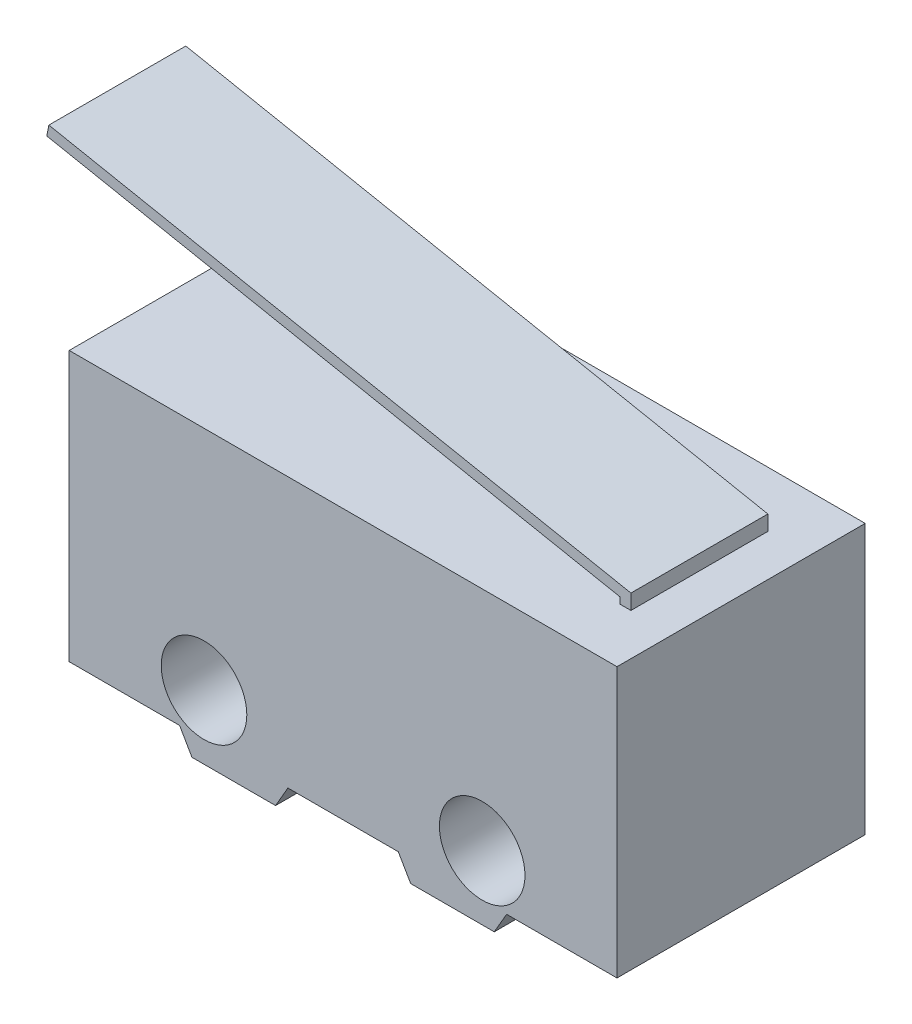
ISO-10303-21;
HEADER;
FILE_DESCRIPTION(('STEP AP214'),'2;1');
FILE_NAME('part.step','',(''),(''),'','','');
FILE_SCHEMA(('AUTOMOTIVE_DESIGN { 1 0 10303 214 1 1 1 1 }'));
ENDSEC;
DATA;
#1=APPLICATION_CONTEXT('core data for automotive mechanical design processes');
#2=APPLICATION_PROTOCOL_DEFINITION('international standard','automotive_design',2000,#1);
#3=PRODUCT_CONTEXT('',#1,'mechanical');
#4=PRODUCT('Part','Part','',(#3));
#5=PRODUCT_RELATED_PRODUCT_CATEGORY('part','',(#4));
#6=PRODUCT_DEFINITION_FORMATION('','',#4);
#7=PRODUCT_DEFINITION_CONTEXT('part definition',#1,'design');
#8=PRODUCT_DEFINITION('design','',#6,#7);
#9=PRODUCT_DEFINITION_SHAPE('','',#8);
#10=(LENGTH_UNIT() NAMED_UNIT(*) SI_UNIT(.MILLI.,.METRE.));
#11=(NAMED_UNIT(*) PLANE_ANGLE_UNIT() SI_UNIT($,.RADIAN.));
#12=(NAMED_UNIT(*) SI_UNIT($,.STERADIAN.) SOLID_ANGLE_UNIT());
#13=UNCERTAINTY_MEASURE_WITH_UNIT(LENGTH_MEASURE(1.E-05),#10,'distance_accuracy_value','');
#14=(GEOMETRIC_REPRESENTATION_CONTEXT(3) GLOBAL_UNCERTAINTY_ASSIGNED_CONTEXT((#13)) GLOBAL_UNIT_ASSIGNED_CONTEXT((#10,
#11,#12)) REPRESENTATION_CONTEXT('',''));
#15=CARTESIAN_POINT('',(0.,0.,0.));
#16=DIRECTION('',(0.,0.,1.));
#17=DIRECTION('',(1.,0.,0.));
#18=AXIS2_PLACEMENT_3D('',#15,#16,#17);
#19=CARTESIAN_POINT('',(6.4,-3.15,2.9));
#20=DIRECTION('',(0.,1.,0.));
#21=DIRECTION('',(-1.,0.,0.));
#22=AXIS2_PLACEMENT_3D('',#19,#20,#21);
#23=PLANE('',#22);
#24=DIRECTION('',(0.,0.,-1.));
#25=VECTOR('',#24,1.);
#26=CARTESIAN_POINT('',(-3.82062673845056,-3.15,2.9));
#27=LINE('',#26,#25);
#28=CARTESIAN_POINT('',(-3.82062673845057,-3.15,2.9));
#29=VERTEX_POINT('',#28);
#30=CARTESIAN_POINT('',(-3.82062673845057,-3.15,-2.9));
#31=VERTEX_POINT('',#30);
#32=EDGE_CURVE('E243',#29,#31,#27,.T.);
#33=ORIENTED_EDGE('',*,*,#32,.F.);
#34=DIRECTION('',(1.,0.,0.));
#35=VECTOR('',#34,1.);
#36=CARTESIAN_POINT('',(6.4,-3.15,2.9));
#37=LINE('',#36,#35);
#38=CARTESIAN_POINT('',(-6.4,-3.15,2.9));
#39=VERTEX_POINT('',#38);
#40=EDGE_CURVE('E276',#39,#29,#37,.T.);
#41=ORIENTED_EDGE('',*,*,#40,.F.);
#42=DIRECTION('',(0.,0.,-1.));
#43=VECTOR('',#42,1.);
#44=CARTESIAN_POINT('',(-6.4,-3.15,2.9));
#45=LINE('',#44,#43);
#46=CARTESIAN_POINT('',(-6.4,-3.15,-2.9));
#47=VERTEX_POINT('',#46);
#48=EDGE_CURVE('E11',#39,#47,#45,.T.);
#49=ORIENTED_EDGE('',*,*,#48,.T.);
#50=DIRECTION('',(1.,0.,0.));
#51=VECTOR('',#50,1.);
#52=CARTESIAN_POINT('',(6.4,-3.15,-2.9));
#53=LINE('',#52,#51);
#54=EDGE_CURVE('E288',#47,#31,#53,.T.);
#55=ORIENTED_EDGE('',*,*,#54,.T.);
#56=EDGE_LOOP('',(#33,#41,#49,#55));
#57=FACE_BOUND('',#56,.T.);
#58=ADVANCED_FACE('F35',(#57),#23,.F.);
#59=DIRECTION('',(0.,0.,1.));
#60=VECTOR('',#59,1.);
#61=CARTESIAN_POINT('',(-1.28968663077472,-3.15,2.9));
#62=LINE('',#61,#60);
#63=CARTESIAN_POINT('',(-1.28968663077472,-3.15,-2.9));
#64=VERTEX_POINT('',#63);
#65=CARTESIAN_POINT('',(-1.28968663077472,-3.15,2.9));
#66=VERTEX_POINT('',#65);
#67=EDGE_CURVE('E235',#64,#66,#62,.T.);
#68=ORIENTED_EDGE('',*,*,#67,.F.);
#69=CARTESIAN_POINT('',(1.28968663077472,-3.15,-2.9));
#70=VERTEX_POINT('',#69);
#71=EDGE_CURVE('E292',#64,#70,#53,.T.);
#72=ORIENTED_EDGE('',*,*,#71,.T.);
#73=DIRECTION('',(0.,0.,1.));
#74=VECTOR('',#73,1.);
#75=CARTESIAN_POINT('',(1.28968663077472,-3.15,2.9));
#76=LINE('',#75,#74);
#77=CARTESIAN_POINT('',(1.28968663077472,-3.15,2.9));
#78=VERTEX_POINT('',#77);
#79=EDGE_CURVE('E262',#70,#78,#76,.T.);
#80=ORIENTED_EDGE('',*,*,#79,.T.);
#81=EDGE_CURVE('E280',#66,#78,#37,.T.);
#82=ORIENTED_EDGE('',*,*,#81,.F.);
#83=EDGE_LOOP('',(#68,#72,#80,#82));
#84=FACE_BOUND('',#83,.T.);
#85=ADVANCED_FACE('F338',(#84),#23,.F.);
#86=CARTESIAN_POINT('',(3.82062673845057,-3.15,2.9));
#87=VERTEX_POINT('',#86);
#88=CARTESIAN_POINT('',(6.4,-3.15,2.9));
#89=VERTEX_POINT('',#88);
#90=EDGE_CURVE('E274',#87,#89,#37,.T.);
#91=ORIENTED_EDGE('',*,*,#90,.F.);
#92=DIRECTION('',(0.,0.,-1.));
#93=VECTOR('',#92,1.);
#94=CARTESIAN_POINT('',(3.82062673845057,-3.15,2.9));
#95=LINE('',#94,#93);
#96=CARTESIAN_POINT('',(3.82062673845057,-3.15,-2.9));
#97=VERTEX_POINT('',#96);
#98=EDGE_CURVE('E267',#87,#97,#95,.T.);
#99=ORIENTED_EDGE('',*,*,#98,.T.);
#100=CARTESIAN_POINT('',(6.4,-3.15,-2.9));
#101=VERTEX_POINT('',#100);
#102=EDGE_CURVE('E287',#97,#101,#53,.T.);
#103=ORIENTED_EDGE('',*,*,#102,.T.);
#104=DIRECTION('',(0.,0.,-1.));
#105=VECTOR('',#104,1.);
#106=CARTESIAN_POINT('',(6.4,-3.15,2.9));
#107=LINE('',#106,#105);
#108=EDGE_CURVE('E43',#89,#101,#107,.T.);
#109=ORIENTED_EDGE('',*,*,#108,.F.);
#110=EDGE_LOOP('',(#91,#99,#103,#109));
#111=FACE_BOUND('',#110,.T.);
#112=ADVANCED_FACE('F339',(#111),#23,.F.);
#113=CARTESIAN_POINT('',(-6.4,3.15,2.9));
#114=DIRECTION('',(1.,0.,0.));
#115=DIRECTION('',(0.,1.,0.));
#116=AXIS2_PLACEMENT_3D('',#113,#114,#115);
#117=PLANE('',#116);
#118=DIRECTION('',(0.,-1.,0.));
#119=VECTOR('',#118,1.);
#120=CARTESIAN_POINT('',(-6.4,3.15,-2.9));
#121=LINE('',#120,#119);
#122=CARTESIAN_POINT('',(-6.4,3.15,-2.9));
#123=VERTEX_POINT('',#122);
#124=EDGE_CURVE('E270',#123,#47,#121,.T.);
#125=ORIENTED_EDGE('',*,*,#124,.T.);
#126=ORIENTED_EDGE('',*,*,#48,.F.);
#127=DIRECTION('',(0.,-1.,0.));
#128=VECTOR('',#127,1.);
#129=CARTESIAN_POINT('',(-6.4,3.15,2.9));
#130=LINE('',#129,#128);
#131=CARTESIAN_POINT('',(-6.4,3.15,2.9));
#132=VERTEX_POINT('',#131);
#133=EDGE_CURVE('E271',#132,#39,#130,.T.);
#134=ORIENTED_EDGE('',*,*,#133,.F.);
#135=DIRECTION('',(0.,0.,-1.));
#136=VECTOR('',#135,1.);
#137=CARTESIAN_POINT('',(-6.4,3.15,2.9));
#138=LINE('',#137,#136);
#139=EDGE_CURVE('E284',#132,#123,#138,.T.);
#140=ORIENTED_EDGE('',*,*,#139,.T.);
#141=EDGE_LOOP('',(#125,#126,#134,#140));
#142=FACE_BOUND('',#141,.T.);
#143=ADVANCED_FACE('F37',(#142),#117,.F.);
#144=CARTESIAN_POINT('',(6.4,3.15,2.9));
#145=DIRECTION('',(-1.,0.,0.));
#146=DIRECTION('',(0.,0.,1.));
#147=AXIS2_PLACEMENT_3D('',#144,#145,#146);
#148=PLANE('',#147);
#149=DIRECTION('',(0.,1.,0.));
#150=VECTOR('',#149,1.);
#151=CARTESIAN_POINT('',(6.4,3.15,-2.9));
#152=LINE('',#151,#150);
#153=CARTESIAN_POINT('',(6.4,3.15,-2.9));
#154=VERTEX_POINT('',#153);
#155=EDGE_CURVE('E291',#101,#154,#152,.T.);
#156=ORIENTED_EDGE('',*,*,#155,.T.);
#157=DIRECTION('',(0.,0.,-1.));
#158=VECTOR('',#157,1.);
#159=CARTESIAN_POINT('',(6.4,3.15,2.9));
#160=LINE('',#159,#158);
#161=CARTESIAN_POINT('',(6.4,3.15,2.9));
#162=VERTEX_POINT('',#161);
#163=EDGE_CURVE('E297',#162,#154,#160,.T.);
#164=ORIENTED_EDGE('',*,*,#163,.F.);
#165=DIRECTION('',(0.,1.,0.));
#166=VECTOR('',#165,1.);
#167=CARTESIAN_POINT('',(6.4,3.15,2.9));
#168=LINE('',#167,#166);
#169=EDGE_CURVE('E279',#89,#162,#168,.T.);
#170=ORIENTED_EDGE('',*,*,#169,.F.);
#171=ORIENTED_EDGE('',*,*,#108,.T.);
#172=EDGE_LOOP('',(#156,#164,#170,#171));
#173=FACE_BOUND('',#172,.T.);
#174=ADVANCED_FACE('F304',(#173),#148,.F.);
#175=CARTESIAN_POINT('',(6.4,3.15,2.9));
#176=DIRECTION('',(0.,-1.,0.));
#177=DIRECTION('',(1.,0.,0.));
#178=AXIS2_PLACEMENT_3D('',#175,#176,#177);
#179=PLANE('',#178);
#180=DIRECTION('',(0.,0.,-1.));
#181=VECTOR('',#180,1.);
#182=CARTESIAN_POINT('',(5.425,3.15,1.6));
#183=LINE('',#182,#181);
#184=CARTESIAN_POINT('',(5.425,3.15,1.6));
#185=VERTEX_POINT('',#184);
#186=CARTESIAN_POINT('',(5.425,3.15,-1.6));
#187=VERTEX_POINT('',#186);
#188=EDGE_CURVE('E55',#185,#187,#183,.T.);
#189=ORIENTED_EDGE('',*,*,#188,.F.);
#190=DIRECTION('',(-1.,0.,0.));
#191=VECTOR('',#190,1.);
#192=CARTESIAN_POINT('',(5.425,3.15,1.6));
#193=LINE('',#192,#191);
#194=CARTESIAN_POINT('',(5.175,3.15,1.6));
#195=VERTEX_POINT('',#194);
#196=EDGE_CURVE('E50',#185,#195,#193,.T.);
#197=ORIENTED_EDGE('',*,*,#196,.T.);
#198=DIRECTION('',(0.,0.,-1.));
#199=VECTOR('',#198,1.);
#200=CARTESIAN_POINT('',(5.175,3.15,1.6));
#201=LINE('',#200,#199);
#202=CARTESIAN_POINT('',(5.175,3.15,-1.6));
#203=VERTEX_POINT('',#202);
#204=EDGE_CURVE('E207',#195,#203,#201,.T.);
#205=ORIENTED_EDGE('',*,*,#204,.T.);
#206=DIRECTION('',(-1.,0.,0.));
#207=VECTOR('',#206,1.);
#208=CARTESIAN_POINT('',(5.425,3.15,-1.6));
#209=LINE('',#208,#207);
#210=EDGE_CURVE('E189',#187,#203,#209,.T.);
#211=ORIENTED_EDGE('',*,*,#210,.F.);
#212=EDGE_LOOP('',(#189,#197,#205,#211));
#213=FACE_BOUND('',#212,.T.);
#214=DIRECTION('',(-1.,0.,0.));
#215=VECTOR('',#214,1.);
#216=CARTESIAN_POINT('',(6.4,3.15,-2.9));
#217=LINE('',#216,#215);
#218=EDGE_CURVE('E275',#154,#123,#217,.T.);
#219=ORIENTED_EDGE('',*,*,#218,.T.);
#220=ORIENTED_EDGE('',*,*,#139,.F.);
#221=DIRECTION('',(-1.,0.,0.));
#222=VECTOR('',#221,1.);
#223=CARTESIAN_POINT('',(6.4,3.15,2.9));
#224=LINE('',#223,#222);
#225=EDGE_CURVE('E282',#162,#132,#224,.T.);
#226=ORIENTED_EDGE('',*,*,#225,.F.);
#227=ORIENTED_EDGE('',*,*,#163,.T.);
#228=EDGE_LOOP('',(#219,#220,#226,#227));
#229=FACE_BOUND('',#228,.T.);
#230=ADVANCED_FACE('F317',(#213,#229),#179,.F.);
#231=CARTESIAN_POINT('',(0.,0.,2.9));
#232=DIRECTION('',(0.,0.,-1.));
#233=DIRECTION('',(-1.,0.,0.));
#234=AXIS2_PLACEMENT_3D('',#231,#232,#233);
#235=PLANE('',#234);
#236=CARTESIAN_POINT('',(-3.25,-2.15,2.9));
#237=DIRECTION('',(0.,0.,1.));
#238=DIRECTION('',(1.,0.,0.));
#239=AXIS2_PLACEMENT_3D('',#236,#237,#238);
#240=CIRCLE('',#239,1.);
#241=CARTESIAN_POINT('',(-2.25,-2.15,2.9));
#242=VERTEX_POINT('',#241);
#243=EDGE_CURVE('E214',#242,#242,#240,.T.);
#244=ORIENTED_EDGE('',*,*,#243,.F.);
#245=EDGE_LOOP('',(#244));
#246=FACE_BOUND('',#245,.T.);
#247=CARTESIAN_POINT('',(3.25,-2.15,2.9));
#248=DIRECTION('',(0.,0.,1.));
#249=DIRECTION('',(1.,0.,0.));
#250=AXIS2_PLACEMENT_3D('',#247,#248,#249);
#251=CIRCLE('',#250,1.);
#252=CARTESIAN_POINT('',(4.25,-2.15,2.9));
#253=VERTEX_POINT('',#252);
#254=EDGE_CURVE('E217',#253,#253,#251,.T.);
#255=ORIENTED_EDGE('',*,*,#254,.F.);
#256=EDGE_LOOP('',(#255));
#257=FACE_BOUND('',#256,.T.);
#258=ORIENTED_EDGE('',*,*,#40,.T.);
#259=DIRECTION('',(-0.5,0.866025403784439,0.));
#260=VECTOR('',#259,1.);
#261=CARTESIAN_POINT('',(-3.53195160385575,-3.65,2.9));
#262=LINE('',#261,#260);
#263=CARTESIAN_POINT('',(-3.53195160385575,-3.65,2.9));
#264=VERTEX_POINT('',#263);
#265=EDGE_CURVE('E233',#264,#29,#262,.T.);
#266=ORIENTED_EDGE('',*,*,#265,.F.);
#267=DIRECTION('',(-1.,0.,0.));
#268=VECTOR('',#267,1.);
#269=CARTESIAN_POINT('',(-1.57836176536953,-3.65,2.9));
#270=LINE('',#269,#268);
#271=CARTESIAN_POINT('',(-1.57836176536953,-3.65,2.9));
#272=VERTEX_POINT('',#271);
#273=EDGE_CURVE('E228',#272,#264,#270,.T.);
#274=ORIENTED_EDGE('',*,*,#273,.F.);
#275=DIRECTION('',(-0.5,-0.866025403784439,0.));
#276=VECTOR('',#275,1.);
#277=CARTESIAN_POINT('',(-0.601566846126417,-1.95814157129579,2.9));
#278=LINE('',#277,#276);
#279=EDGE_CURVE('E230',#66,#272,#278,.T.);
#280=ORIENTED_EDGE('',*,*,#279,.F.);
#281=ORIENTED_EDGE('',*,*,#81,.T.);
#282=DIRECTION('',(0.5,-0.866025403784439,0.));
#283=VECTOR('',#282,1.);
#284=CARTESIAN_POINT('',(0.601566846126417,-1.95814157129579,2.9));
#285=LINE('',#284,#283);
#286=CARTESIAN_POINT('',(1.57836176536953,-3.65,2.9));
#287=VERTEX_POINT('',#286);
#288=EDGE_CURVE('E245',#78,#287,#285,.T.);
#289=ORIENTED_EDGE('',*,*,#288,.T.);
#290=DIRECTION('',(1.,0.,0.));
#291=VECTOR('',#290,1.);
#292=CARTESIAN_POINT('',(1.57836176536953,-3.65,2.9));
#293=LINE('',#292,#291);
#294=CARTESIAN_POINT('',(3.53195160385575,-3.65,2.9));
#295=VERTEX_POINT('',#294);
#296=EDGE_CURVE('E256',#287,#295,#293,.T.);
#297=ORIENTED_EDGE('',*,*,#296,.T.);
#298=DIRECTION('',(0.5,0.866025403784439,0.));
#299=VECTOR('',#298,1.);
#300=CARTESIAN_POINT('',(3.53195160385575,-3.65,2.9));
#301=LINE('',#300,#299);
#302=EDGE_CURVE('E249',#295,#87,#301,.T.);
#303=ORIENTED_EDGE('',*,*,#302,.T.);
#304=ORIENTED_EDGE('',*,*,#90,.T.);
#305=ORIENTED_EDGE('',*,*,#169,.T.);
#306=ORIENTED_EDGE('',*,*,#225,.T.);
#307=ORIENTED_EDGE('',*,*,#133,.T.);
#308=EDGE_LOOP('',(#258,#266,#274,#280,#281,#289,#297,#303,#304,#305,#306,#307));
#309=FACE_BOUND('',#308,.T.);
#310=ADVANCED_FACE('F323',(#246,#257,#309),#235,.F.);
#311=CARTESIAN_POINT('',(0.,0.,-2.9));
#312=DIRECTION('',(0.,0.,-1.));
#313=DIRECTION('',(-1.,0.,0.));
#314=AXIS2_PLACEMENT_3D('',#311,#312,#313);
#315=PLANE('',#314);
#316=CARTESIAN_POINT('',(-3.25,-2.15,-2.9));
#317=DIRECTION('',(0.,0.,1.));
#318=DIRECTION('',(1.,0.,0.));
#319=AXIS2_PLACEMENT_3D('',#316,#317,#318);
#320=CIRCLE('',#319,1.);
#321=CARTESIAN_POINT('',(-2.25,-2.15,-2.9));
#322=VERTEX_POINT('',#321);
#323=EDGE_CURVE('E210',#322,#322,#320,.T.);
#324=ORIENTED_EDGE('',*,*,#323,.T.);
#325=EDGE_LOOP('',(#324));
#326=FACE_BOUND('',#325,.T.);
#327=CARTESIAN_POINT('',(3.25,-2.15,-2.9));
#328=DIRECTION('',(0.,0.,1.));
#329=DIRECTION('',(1.,0.,0.));
#330=AXIS2_PLACEMENT_3D('',#327,#328,#329);
#331=CIRCLE('',#330,1.);
#332=CARTESIAN_POINT('',(4.25,-2.15,-2.9));
#333=VERTEX_POINT('',#332);
#334=EDGE_CURVE('E209',#333,#333,#331,.T.);
#335=ORIENTED_EDGE('',*,*,#334,.T.);
#336=EDGE_LOOP('',(#335));
#337=FACE_BOUND('',#336,.T.);
#338=ORIENTED_EDGE('',*,*,#71,.F.);
#339=DIRECTION('',(-0.5,-0.866025403784439,0.));
#340=VECTOR('',#339,1.);
#341=CARTESIAN_POINT('',(-0.601566846126417,-1.95814157129579,-2.9));
#342=LINE('',#341,#340);
#343=CARTESIAN_POINT('',(-1.57836176536953,-3.65,-2.9));
#344=VERTEX_POINT('',#343);
#345=EDGE_CURVE('E237',#64,#344,#342,.T.);
#346=ORIENTED_EDGE('',*,*,#345,.T.);
#347=DIRECTION('',(-1.,0.,0.));
#348=VECTOR('',#347,1.);
#349=CARTESIAN_POINT('',(-1.57836176536953,-3.65,-2.9));
#350=LINE('',#349,#348);
#351=CARTESIAN_POINT('',(-3.53195160385575,-3.65,-2.9));
#352=VERTEX_POINT('',#351);
#353=EDGE_CURVE('E227',#344,#352,#350,.T.);
#354=ORIENTED_EDGE('',*,*,#353,.T.);
#355=DIRECTION('',(-0.5,0.866025403784439,0.));
#356=VECTOR('',#355,1.);
#357=CARTESIAN_POINT('',(-3.53195160385575,-3.65,-2.9));
#358=LINE('',#357,#356);
#359=EDGE_CURVE('E231',#352,#31,#358,.T.);
#360=ORIENTED_EDGE('',*,*,#359,.T.);
#361=ORIENTED_EDGE('',*,*,#54,.F.);
#362=ORIENTED_EDGE('',*,*,#124,.F.);
#363=ORIENTED_EDGE('',*,*,#218,.F.);
#364=ORIENTED_EDGE('',*,*,#155,.F.);
#365=ORIENTED_EDGE('',*,*,#102,.F.);
#366=DIRECTION('',(0.5,0.866025403784439,0.));
#367=VECTOR('',#366,1.);
#368=CARTESIAN_POINT('',(3.53195160385575,-3.65,-2.9));
#369=LINE('',#368,#367);
#370=CARTESIAN_POINT('',(3.53195160385575,-3.65,-2.9));
#371=VERTEX_POINT('',#370);
#372=EDGE_CURVE('E252',#371,#97,#369,.T.);
#373=ORIENTED_EDGE('',*,*,#372,.F.);
#374=DIRECTION('',(1.,0.,0.));
#375=VECTOR('',#374,1.);
#376=CARTESIAN_POINT('',(1.57836176536953,-3.65,-2.9));
#377=LINE('',#376,#375);
#378=CARTESIAN_POINT('',(1.57836176536953,-3.65,-2.9));
#379=VERTEX_POINT('',#378);
#380=EDGE_CURVE('E248',#379,#371,#377,.T.);
#381=ORIENTED_EDGE('',*,*,#380,.F.);
#382=DIRECTION('',(0.5,-0.866025403784439,0.));
#383=VECTOR('',#382,1.);
#384=CARTESIAN_POINT('',(0.601566846126417,-1.95814157129579,-2.9));
#385=LINE('',#384,#383);
#386=EDGE_CURVE('E246',#70,#379,#385,.T.);
#387=ORIENTED_EDGE('',*,*,#386,.F.);
#388=EDGE_LOOP('',(#338,#346,#354,#360,#361,#362,#363,#364,#365,#373,#381,#387));
#389=FACE_BOUND('',#388,.T.);
#390=ADVANCED_FACE('F312',(#326,#337,#389),#315,.T.);
#391=CARTESIAN_POINT('',(3.53195160385575,-3.65,-2.9));
#392=DIRECTION('',(0.866025403784439,-0.5,0.));
#393=DIRECTION('',(0.5,0.866025403784439,0.));
#394=AXIS2_PLACEMENT_3D('',#391,#392,#393);
#395=PLANE('',#394);
#396=ORIENTED_EDGE('',*,*,#98,.F.);
#397=ORIENTED_EDGE('',*,*,#302,.F.);
#398=DIRECTION('',(0.,0.,1.));
#399=VECTOR('',#398,1.);
#400=CARTESIAN_POINT('',(3.53195160385575,-3.65,-2.9));
#401=LINE('',#400,#399);
#402=EDGE_CURVE('E260',#371,#295,#401,.T.);
#403=ORIENTED_EDGE('',*,*,#402,.F.);
#404=ORIENTED_EDGE('',*,*,#372,.T.);
#405=EDGE_LOOP('',(#396,#397,#403,#404));
#406=FACE_BOUND('',#405,.T.);
#407=ADVANCED_FACE('F341',(#406),#395,.T.);
#408=CARTESIAN_POINT('',(0.601566846126417,-1.95814157129579,-2.9));
#409=DIRECTION('',(-0.866025403784439,-0.5,0.));
#410=DIRECTION('',(0.5,-0.866025403784439,0.));
#411=AXIS2_PLACEMENT_3D('',#408,#409,#410);
#412=PLANE('',#411);
#413=ORIENTED_EDGE('',*,*,#79,.F.);
#414=ORIENTED_EDGE('',*,*,#386,.T.);
#415=DIRECTION('',(0.,0.,1.));
#416=VECTOR('',#415,1.);
#417=CARTESIAN_POINT('',(1.57836176536953,-3.65,-2.9));
#418=LINE('',#417,#416);
#419=EDGE_CURVE('E254',#379,#287,#418,.T.);
#420=ORIENTED_EDGE('',*,*,#419,.T.);
#421=ORIENTED_EDGE('',*,*,#288,.F.);
#422=EDGE_LOOP('',(#413,#414,#420,#421));
#423=FACE_BOUND('',#422,.T.);
#424=ADVANCED_FACE('F334',(#423),#412,.T.);
#425=CARTESIAN_POINT('',(1.57836176536953,-3.65,-2.9));
#426=DIRECTION('',(0.,-1.,0.));
#427=DIRECTION('',(0.,0.,-1.));
#428=AXIS2_PLACEMENT_3D('',#425,#426,#427);
#429=PLANE('',#428);
#430=ORIENTED_EDGE('',*,*,#296,.F.);
#431=ORIENTED_EDGE('',*,*,#419,.F.);
#432=ORIENTED_EDGE('',*,*,#380,.T.);
#433=ORIENTED_EDGE('',*,*,#402,.T.);
#434=EDGE_LOOP('',(#430,#431,#432,#433));
#435=FACE_BOUND('',#434,.T.);
#436=ADVANCED_FACE('F344',(#435),#429,.T.);
#437=CARTESIAN_POINT('',(-3.53195160385575,-3.65,-2.9));
#438=DIRECTION('',(0.866025403784439,0.5,0.));
#439=DIRECTION('',(-0.5,0.866025403784439,0.));
#440=AXIS2_PLACEMENT_3D('',#437,#438,#439);
#441=PLANE('',#440);
#442=ORIENTED_EDGE('',*,*,#265,.T.);
#443=ORIENTED_EDGE('',*,*,#32,.T.);
#444=ORIENTED_EDGE('',*,*,#359,.F.);
#445=DIRECTION('',(0.,0.,1.));
#446=VECTOR('',#445,1.);
#447=CARTESIAN_POINT('',(-3.53195160385575,-3.65,-2.9));
#448=LINE('',#447,#446);
#449=EDGE_CURVE('E224',#352,#264,#448,.T.);
#450=ORIENTED_EDGE('',*,*,#449,.T.);
#451=EDGE_LOOP('',(#442,#443,#444,#450));
#452=FACE_BOUND('',#451,.T.);
#453=ADVANCED_FACE('F346',(#452),#441,.F.);
#454=CARTESIAN_POINT('',(-0.601566846126417,-1.95814157129579,-2.9));
#455=DIRECTION('',(-0.866025403784439,0.5,0.));
#456=DIRECTION('',(-0.5,-0.866025403784439,0.));
#457=AXIS2_PLACEMENT_3D('',#454,#455,#456);
#458=PLANE('',#457);
#459=ORIENTED_EDGE('',*,*,#345,.F.);
#460=ORIENTED_EDGE('',*,*,#67,.T.);
#461=ORIENTED_EDGE('',*,*,#279,.T.);
#462=DIRECTION('',(0.,0.,1.));
#463=VECTOR('',#462,1.);
#464=CARTESIAN_POINT('',(-1.57836176536953,-3.65,-2.9));
#465=LINE('',#464,#463);
#466=EDGE_CURVE('E213',#344,#272,#465,.T.);
#467=ORIENTED_EDGE('',*,*,#466,.F.);
#468=EDGE_LOOP('',(#459,#460,#461,#467));
#469=FACE_BOUND('',#468,.T.);
#470=ADVANCED_FACE('F352',(#469),#458,.F.);
#471=CARTESIAN_POINT('',(-1.57836176536953,-3.65,-2.9));
#472=DIRECTION('',(0.,1.,0.));
#473=DIRECTION('',(0.,0.,1.));
#474=AXIS2_PLACEMENT_3D('',#471,#472,#473);
#475=PLANE('',#474);
#476=ORIENTED_EDGE('',*,*,#273,.T.);
#477=ORIENTED_EDGE('',*,*,#449,.F.);
#478=ORIENTED_EDGE('',*,*,#353,.F.);
#479=ORIENTED_EDGE('',*,*,#466,.T.);
#480=EDGE_LOOP('',(#476,#477,#478,#479));
#481=FACE_BOUND('',#480,.T.);
#482=ADVANCED_FACE('F390',(#481),#475,.F.);
#483=CARTESIAN_POINT('',(3.25,-2.15,-2.9));
#484=DIRECTION('',(0.,0.,1.));
#485=DIRECTION('',(1.,0.,0.));
#486=AXIS2_PLACEMENT_3D('',#483,#484,#485);
#487=CYLINDRICAL_SURFACE('',#486,1.);
#488=ORIENTED_EDGE('',*,*,#334,.F.);
#489=EDGE_LOOP('',(#488));
#490=FACE_BOUND('',#489,.T.);
#491=ORIENTED_EDGE('',*,*,#254,.T.);
#492=EDGE_LOOP('',(#491));
#493=FACE_BOUND('',#492,.T.);
#494=ADVANCED_FACE('F387',(#490,#493),#487,.F.);
#495=CARTESIAN_POINT('',(-3.25,-2.15,-2.9));
#496=DIRECTION('',(0.,0.,1.));
#497=DIRECTION('',(1.,0.,0.));
#498=AXIS2_PLACEMENT_3D('',#495,#496,#497);
#499=CYLINDRICAL_SURFACE('',#498,1.);
#500=ORIENTED_EDGE('',*,*,#323,.F.);
#501=EDGE_LOOP('',(#500));
#502=FACE_BOUND('',#501,.T.);
#503=ORIENTED_EDGE('',*,*,#243,.T.);
#504=EDGE_LOOP('',(#503));
#505=FACE_BOUND('',#504,.T.);
#506=ADVANCED_FACE('F389',(#502,#505),#499,.F.);
#507=CARTESIAN_POINT('',(5.175,3.4,1.6));
#508=DIRECTION('',(1.,0.,0.));
#509=DIRECTION('',(0.,0.,-1.));
#510=AXIS2_PLACEMENT_3D('',#507,#508,#509);
#511=PLANE('',#510);
#512=DIRECTION('',(0.,1.,0.));
#513=VECTOR('',#512,1.);
#514=CARTESIAN_POINT('',(5.175,3.4,-1.6));
#515=LINE('',#514,#513);
#516=CARTESIAN_POINT('',(5.175,3.29715153477498,-1.6));
#517=VERTEX_POINT('',#516);
#518=EDGE_CURVE('E186',#517,#203,#515,.F.);
#519=ORIENTED_EDGE('',*,*,#518,.T.);
#520=ORIENTED_EDGE('',*,*,#204,.F.);
#521=DIRECTION('',(0.,1.,0.));
#522=VECTOR('',#521,1.);
#523=CARTESIAN_POINT('',(5.175,3.4,1.6));
#524=LINE('',#523,#522);
#525=CARTESIAN_POINT('',(5.175,3.29715153477498,1.6));
#526=VERTEX_POINT('',#525);
#527=EDGE_CURVE('E200',#526,#195,#524,.F.);
#528=ORIENTED_EDGE('',*,*,#527,.F.);
#529=DIRECTION('',(0.,0.,-1.));
#530=VECTOR('',#529,1.);
#531=CARTESIAN_POINT('',(5.175,3.29715153477498,1.6));
#532=LINE('',#531,#530);
#533=EDGE_CURVE('E185',#526,#517,#532,.T.);
#534=ORIENTED_EDGE('',*,*,#533,.T.);
#535=EDGE_LOOP('',(#519,#520,#528,#534));
#536=FACE_BOUND('',#535,.T.);
#537=ADVANCED_FACE('F397',(#536),#511,.F.);
#538=CARTESIAN_POINT('',(5.425,3.4,1.6));
#539=DIRECTION('',(1.,0.,0.));
#540=DIRECTION('',(0.,0.,-1.));
#541=AXIS2_PLACEMENT_3D('',#538,#539,#540);
#542=PLANE('',#541);
#543=DIRECTION('',(0.,1.,0.));
#544=VECTOR('',#543,1.);
#545=CARTESIAN_POINT('',(5.425,3.4,-1.6));
#546=LINE('',#545,#544);
#547=CARTESIAN_POINT('',(5.425,3.50284846522502,-1.6));
#548=VERTEX_POINT('',#547);
#549=EDGE_CURVE('E163',#548,#187,#546,.F.);
#550=ORIENTED_EDGE('',*,*,#549,.F.);
#551=DIRECTION('',(0.,0.,-1.));
#552=VECTOR('',#551,1.);
#553=CARTESIAN_POINT('',(5.425,3.50284846522502,1.6));
#554=LINE('',#553,#552);
#555=CARTESIAN_POINT('',(5.425,3.50284846522502,1.6));
#556=VERTEX_POINT('',#555);
#557=EDGE_CURVE('E158',#556,#548,#554,.T.);
#558=ORIENTED_EDGE('',*,*,#557,.F.);
#559=DIRECTION('',(0.,1.,0.));
#560=VECTOR('',#559,1.);
#561=CARTESIAN_POINT('',(5.425,3.4,1.6));
#562=LINE('',#561,#560);
#563=EDGE_CURVE('E161',#556,#185,#562,.F.);
#564=ORIENTED_EDGE('',*,*,#563,.T.);
#565=ORIENTED_EDGE('',*,*,#188,.T.);
#566=EDGE_LOOP('',(#550,#558,#564,#565));
#567=FACE_BOUND('',#566,.T.);
#568=ADVANCED_FACE('F160',(#567),#542,.T.);
#569=CARTESIAN_POINT('',(5.32407754081245,3.52265917017665,1.6));
#570=DIRECTION('',(0.192620326499629,0.981273361413208,0.));
#571=DIRECTION('',(-0.981273361413208,0.19262032649963,0.));
#572=AXIS2_PLACEMENT_3D('',#569,#570,#571);
#573=PLANE('',#572);
#574=DIRECTION('',(0.981273361413208,-0.19262032649963,0.));
#575=VECTOR('',#574,1.);
#576=CARTESIAN_POINT('',(5.32407754081245,3.52265917017665,-1.6));
#577=LINE('',#576,#575);
#578=CARTESIAN_POINT('',(-8.17592245918755,6.17265917017665,-1.6));
#579=VERTEX_POINT('',#578);
#580=EDGE_CURVE('E193',#579,#548,#577,.T.);
#581=ORIENTED_EDGE('',*,*,#580,.F.);
#582=DIRECTION('',(0.,0.,-1.));
#583=VECTOR('',#582,1.);
#584=CARTESIAN_POINT('',(-8.17592245918755,6.17265917017665,1.6));
#585=LINE('',#584,#583);
#586=CARTESIAN_POINT('',(-8.17592245918755,6.17265917017665,1.6));
#587=VERTEX_POINT('',#586);
#588=EDGE_CURVE('E168',#587,#579,#585,.T.);
#589=ORIENTED_EDGE('',*,*,#588,.F.);
#590=DIRECTION('',(0.981273361413208,-0.19262032649963,0.));
#591=VECTOR('',#590,1.);
#592=CARTESIAN_POINT('',(5.32407754081245,3.52265917017665,1.6));
#593=LINE('',#592,#591);
#594=EDGE_CURVE('E174',#587,#556,#593,.T.);
#595=ORIENTED_EDGE('',*,*,#594,.T.);
#596=ORIENTED_EDGE('',*,*,#557,.T.);
#597=EDGE_LOOP('',(#581,#589,#595,#596));
#598=FACE_BOUND('',#597,.T.);
#599=ADVANCED_FACE('F177',(#598),#573,.T.);
#600=CARTESIAN_POINT('',(-8.22407754081246,5.92734082982335,1.6));
#601=DIRECTION('',(-0.981273361413209,0.192620326499623,0.));
#602=DIRECTION('',(-0.192620326499623,-0.981273361413209,0.));
#603=AXIS2_PLACEMENT_3D('',#600,#601,#602);
#604=PLANE('',#603);
#605=DIRECTION('',(0.192620326499623,0.981273361413209,0.));
#606=VECTOR('',#605,1.);
#607=CARTESIAN_POINT('',(-8.22407754081246,5.92734082982335,-1.6));
#608=LINE('',#607,#606);
#609=CARTESIAN_POINT('',(-8.22407754081246,5.92734082982335,-1.6));
#610=VERTEX_POINT('',#609);
#611=EDGE_CURVE('E195',#610,#579,#608,.T.);
#612=ORIENTED_EDGE('',*,*,#611,.F.);
#613=DIRECTION('',(0.,0.,-1.));
#614=VECTOR('',#613,1.);
#615=CARTESIAN_POINT('',(-8.22407754081246,5.92734082982335,1.6));
#616=LINE('',#615,#614);
#617=CARTESIAN_POINT('',(-8.22407754081246,5.92734082982335,1.6));
#618=VERTEX_POINT('',#617);
#619=EDGE_CURVE('E203',#618,#610,#616,.T.);
#620=ORIENTED_EDGE('',*,*,#619,.F.);
#621=DIRECTION('',(0.192620326499623,0.981273361413209,0.));
#622=VECTOR('',#621,1.);
#623=CARTESIAN_POINT('',(-8.22407754081246,5.92734082982335,1.6));
#624=LINE('',#623,#622);
#625=EDGE_CURVE('E178',#618,#587,#624,.T.);
#626=ORIENTED_EDGE('',*,*,#625,.T.);
#627=ORIENTED_EDGE('',*,*,#588,.T.);
#628=EDGE_LOOP('',(#612,#620,#626,#627));
#629=FACE_BOUND('',#628,.T.);
#630=ADVANCED_FACE('F491',(#629),#604,.T.);
#631=CARTESIAN_POINT('',(5.27592245918755,3.27734082982335,1.6));
#632=DIRECTION('',(0.192620326499629,0.981273361413208,0.));
#633=DIRECTION('',(-0.981273361413208,0.19262032649963,0.));
#634=AXIS2_PLACEMENT_3D('',#631,#632,#633);
#635=PLANE('',#634);
#636=DIRECTION('',(0.981273361413208,-0.19262032649963,0.));
#637=VECTOR('',#636,1.);
#638=CARTESIAN_POINT('',(5.27592245918755,3.27734082982335,-1.6));
#639=LINE('',#638,#637);
#640=EDGE_CURVE('E198',#610,#517,#639,.T.);
#641=ORIENTED_EDGE('',*,*,#640,.T.);
#642=ORIENTED_EDGE('',*,*,#533,.F.);
#643=DIRECTION('',(0.981273361413208,-0.19262032649963,0.));
#644=VECTOR('',#643,1.);
#645=CARTESIAN_POINT('',(5.27592245918755,3.27734082982335,1.6));
#646=LINE('',#645,#644);
#647=EDGE_CURVE('E180',#618,#526,#646,.T.);
#648=ORIENTED_EDGE('',*,*,#647,.F.);
#649=ORIENTED_EDGE('',*,*,#619,.T.);
#650=EDGE_LOOP('',(#641,#642,#648,#649));
#651=FACE_BOUND('',#650,.T.);
#652=ADVANCED_FACE('F500',(#651),#635,.F.);
#653=CARTESIAN_POINT('',(0.,0.,1.6));
#654=DIRECTION('',(0.,0.,1.));
#655=DIRECTION('',(1.,0.,0.));
#656=AXIS2_PLACEMENT_3D('',#653,#654,#655);
#657=PLANE('',#656);
#658=ORIENTED_EDGE('',*,*,#527,.T.);
#659=ORIENTED_EDGE('',*,*,#196,.F.);
#660=ORIENTED_EDGE('',*,*,#563,.F.);
#661=ORIENTED_EDGE('',*,*,#594,.F.);
#662=ORIENTED_EDGE('',*,*,#625,.F.);
#663=ORIENTED_EDGE('',*,*,#647,.T.);
#664=EDGE_LOOP('',(#658,#659,#660,#661,#662,#663));
#665=FACE_BOUND('',#664,.T.);
#666=ADVANCED_FACE('F172',(#665),#657,.T.);
#667=CARTESIAN_POINT('',(0.,0.,-1.6));
#668=DIRECTION('',(0.,0.,1.));
#669=DIRECTION('',(1.,0.,0.));
#670=AXIS2_PLACEMENT_3D('',#667,#668,#669);
#671=PLANE('',#670);
#672=ORIENTED_EDGE('',*,*,#518,.F.);
#673=ORIENTED_EDGE('',*,*,#640,.F.);
#674=ORIENTED_EDGE('',*,*,#611,.T.);
#675=ORIENTED_EDGE('',*,*,#580,.T.);
#676=ORIENTED_EDGE('',*,*,#549,.T.);
#677=ORIENTED_EDGE('',*,*,#210,.T.);
#678=EDGE_LOOP('',(#672,#673,#674,#675,#676,#677));
#679=FACE_BOUND('',#678,.T.);
#680=ADVANCED_FACE('F519',(#679),#671,.F.);
#681=CLOSED_SHELL('',(#58,#85,#112,#143,#174,#230,#310,#390,#407,#424,#436,#453,#470,#482,#494,
#506,#537,#568,#599,#630,#652,#666,#680));
#682=MANIFOLD_SOLID_BREP('B2',#681);
#683=ADVANCED_BREP_SHAPE_REPRESENTATION('',(#18,#682),#14);
#684=SHAPE_DEFINITION_REPRESENTATION(#9,#683);
ENDSEC;
END-ISO-10303-21;
